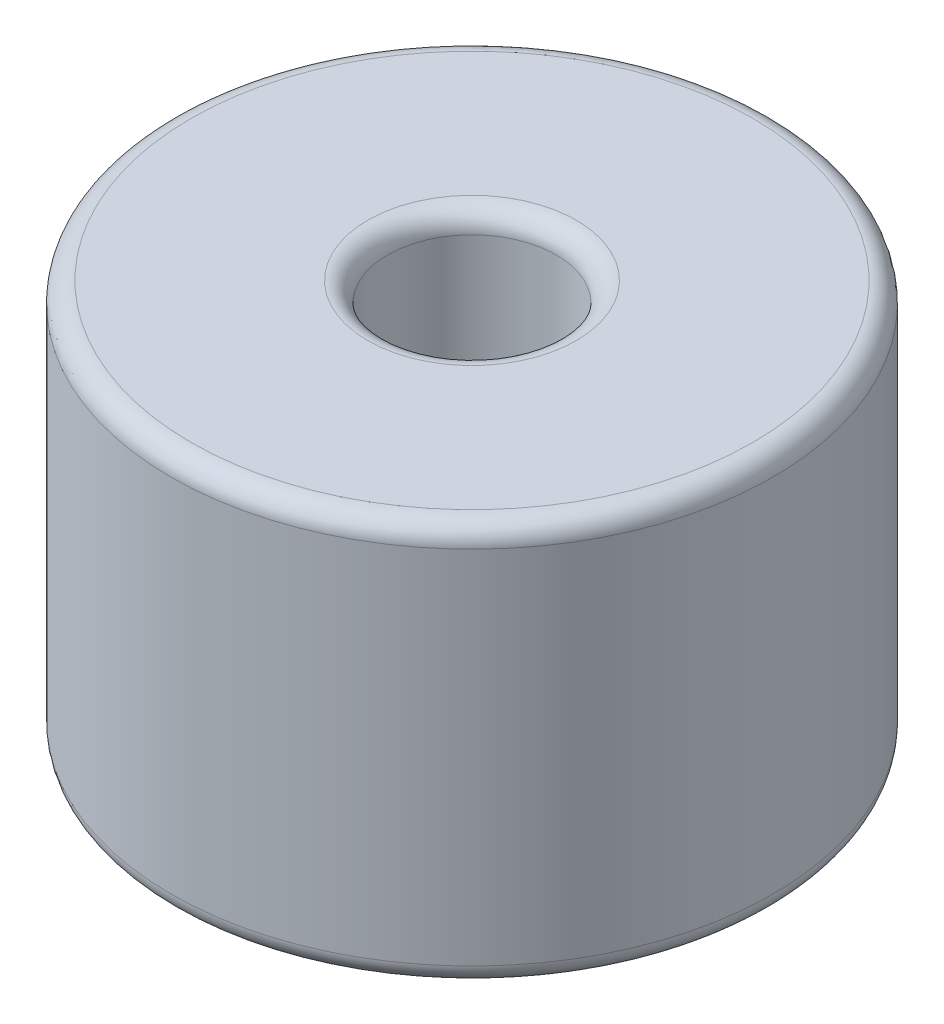
ISO-10303-21;
HEADER;
FILE_DESCRIPTION(('STEP AP214'),'2;1');
FILE_NAME('part.step','',(''),(''),'','','');
FILE_SCHEMA(('AUTOMOTIVE_DESIGN { 1 0 10303 214 1 1 1 1 }'));
ENDSEC;
DATA;
#1=APPLICATION_CONTEXT('core data for automotive mechanical design processes');
#2=APPLICATION_PROTOCOL_DEFINITION('international standard','automotive_design',2000,#1);
#3=PRODUCT_CONTEXT('',#1,'mechanical');
#4=PRODUCT('Part','Part','',(#3));
#5=PRODUCT_RELATED_PRODUCT_CATEGORY('part','',(#4));
#6=PRODUCT_DEFINITION_FORMATION('','',#4);
#7=PRODUCT_DEFINITION_CONTEXT('part definition',#1,'design');
#8=PRODUCT_DEFINITION('design','',#6,#7);
#9=PRODUCT_DEFINITION_SHAPE('','',#8);
#10=(LENGTH_UNIT() NAMED_UNIT(*) SI_UNIT(.MILLI.,.METRE.));
#11=(NAMED_UNIT(*) PLANE_ANGLE_UNIT() SI_UNIT($,.RADIAN.));
#12=(NAMED_UNIT(*) SI_UNIT($,.STERADIAN.) SOLID_ANGLE_UNIT());
#13=UNCERTAINTY_MEASURE_WITH_UNIT(LENGTH_MEASURE(1.E-05),#10,'distance_accuracy_value','');
#14=(GEOMETRIC_REPRESENTATION_CONTEXT(3) GLOBAL_UNCERTAINTY_ASSIGNED_CONTEXT((#13)) GLOBAL_UNIT_ASSIGNED_CONTEXT((#10,
#11,#12)) REPRESENTATION_CONTEXT('',''));
#15=CARTESIAN_POINT('',(0.,0.,0.));
#16=DIRECTION('',(0.,0.,1.));
#17=DIRECTION('',(1.,0.,0.));
#18=AXIS2_PLACEMENT_3D('',#15,#16,#17);
#19=CARTESIAN_POINT('',(0.,10.,0.));
#20=DIRECTION('',(0.,1.,0.));
#21=DIRECTION('',(0.,0.,1.));
#22=AXIS2_PLACEMENT_3D('',#19,#20,#21);
#23=PLANE('',#22);
#24=CARTESIAN_POINT('',(0.,10.,0.));
#25=DIRECTION('',(0.,1.,0.));
#26=DIRECTION('',(0.,0.,1.));
#27=AXIS2_PLACEMENT_3D('',#24,#25,#26);
#28=CIRCLE('',#27,2.6);
#29=CARTESIAN_POINT('',(0.,10.,2.6));
#30=VERTEX_POINT('',#29);
#31=EDGE_CURVE('E42',#30,#30,#28,.F.);
#32=ORIENTED_EDGE('',*,*,#31,.T.);
#33=EDGE_LOOP('',(#32));
#34=FACE_BOUND('',#33,.T.);
#35=CARTESIAN_POINT('',(0.,10.,0.));
#36=DIRECTION('',(0.,1.,0.));
#37=DIRECTION('',(0.,0.,1.));
#38=AXIS2_PLACEMENT_3D('',#35,#36,#37);
#39=CIRCLE('',#38,7.);
#40=CARTESIAN_POINT('',(0.,10.,7.));
#41=VERTEX_POINT('',#40);
#42=EDGE_CURVE('E46',#41,#41,#39,.T.);
#43=ORIENTED_EDGE('',*,*,#42,.T.);
#44=EDGE_LOOP('',(#43));
#45=FACE_BOUND('',#44,.T.);
#46=ADVANCED_FACE('F31',(#34,#45),#23,.T.);
#47=CARTESIAN_POINT('',(0.,0.,0.));
#48=DIRECTION('',(0.,1.,0.));
#49=DIRECTION('',(0.,0.,1.));
#50=AXIS2_PLACEMENT_3D('',#47,#48,#49);
#51=PLANE('',#50);
#52=CARTESIAN_POINT('',(0.,0.,0.));
#53=DIRECTION('',(0.,1.,0.));
#54=DIRECTION('',(0.,0.,1.));
#55=AXIS2_PLACEMENT_3D('',#52,#53,#54);
#56=CIRCLE('',#55,2.6);
#57=CARTESIAN_POINT('',(0.,0.,2.6));
#58=VERTEX_POINT('',#57);
#59=EDGE_CURVE('E57',#58,#58,#56,.T.);
#60=ORIENTED_EDGE('',*,*,#59,.T.);
#61=EDGE_LOOP('',(#60));
#62=FACE_BOUND('',#61,.T.);
#63=CARTESIAN_POINT('',(0.,0.,0.));
#64=DIRECTION('',(0.,1.,0.));
#65=DIRECTION('',(0.,0.,1.));
#66=AXIS2_PLACEMENT_3D('',#63,#64,#65);
#67=CIRCLE('',#66,7.);
#68=CARTESIAN_POINT('',(0.,0.,7.));
#69=VERTEX_POINT('',#68);
#70=EDGE_CURVE('E60',#69,#69,#67,.F.);
#71=ORIENTED_EDGE('',*,*,#70,.T.);
#72=EDGE_LOOP('',(#71));
#73=FACE_BOUND('',#72,.T.);
#74=ADVANCED_FACE('F64',(#62,#73),#51,.F.);
#75=CARTESIAN_POINT('',(0.,10.,0.));
#76=DIRECTION('',(0.,-1.,0.));
#77=DIRECTION('',(0.,0.,-1.));
#78=AXIS2_PLACEMENT_3D('',#75,#76,#77);
#79=CYLINDRICAL_SURFACE('',#78,7.5);
#80=CARTESIAN_POINT('',(0.,0.5,0.));
#81=DIRECTION('',(0.,1.,0.));
#82=DIRECTION('',(0.,0.,1.));
#83=AXIS2_PLACEMENT_3D('',#80,#81,#82);
#84=CIRCLE('',#83,7.5);
#85=CARTESIAN_POINT('',(0.,0.5,7.5));
#86=VERTEX_POINT('',#85);
#87=EDGE_CURVE('E10',#86,#86,#84,.T.);
#88=ORIENTED_EDGE('',*,*,#87,.T.);
#89=EDGE_LOOP('',(#88));
#90=FACE_BOUND('',#89,.T.);
#91=CARTESIAN_POINT('',(0.,9.5,0.));
#92=DIRECTION('',(0.,1.,0.));
#93=DIRECTION('',(0.,0.,1.));
#94=AXIS2_PLACEMENT_3D('',#91,#92,#93);
#95=CIRCLE('',#94,7.5);
#96=CARTESIAN_POINT('',(0.,9.5,7.5));
#97=VERTEX_POINT('',#96);
#98=EDGE_CURVE('E38',#97,#97,#95,.F.);
#99=ORIENTED_EDGE('',*,*,#98,.T.);
#100=EDGE_LOOP('',(#99));
#101=FACE_BOUND('',#100,.T.);
#102=ADVANCED_FACE('F84',(#90,#101),#79,.T.);
#103=CARTESIAN_POINT('',(0.,10.,0.));
#104=DIRECTION('',(0.,-1.,0.));
#105=DIRECTION('',(0.,0.,-1.));
#106=AXIS2_PLACEMENT_3D('',#103,#104,#105);
#107=CYLINDRICAL_SURFACE('',#106,2.1);
#108=CARTESIAN_POINT('',(0.,0.5,0.));
#109=DIRECTION('',(0.,1.,0.));
#110=DIRECTION('',(0.,0.,1.));
#111=AXIS2_PLACEMENT_3D('',#108,#109,#110);
#112=CIRCLE('',#111,2.1);
#113=CARTESIAN_POINT('',(0.,0.5,2.1));
#114=VERTEX_POINT('',#113);
#115=EDGE_CURVE('E51',#114,#114,#112,.F.);
#116=ORIENTED_EDGE('',*,*,#115,.T.);
#117=EDGE_LOOP('',(#116));
#118=FACE_BOUND('',#117,.T.);
#119=CARTESIAN_POINT('',(0.,9.5,0.));
#120=DIRECTION('',(0.,1.,0.));
#121=DIRECTION('',(0.,0.,1.));
#122=AXIS2_PLACEMENT_3D('',#119,#120,#121);
#123=CIRCLE('',#122,2.1);
#124=CARTESIAN_POINT('',(0.,9.5,2.1));
#125=VERTEX_POINT('',#124);
#126=EDGE_CURVE('E54',#125,#125,#123,.T.);
#127=ORIENTED_EDGE('',*,*,#126,.T.);
#128=EDGE_LOOP('',(#127));
#129=FACE_BOUND('',#128,.T.);
#130=ADVANCED_FACE('F89',(#118,#129),#107,.F.);
#131=CARTESIAN_POINT('',(0.,0.5,0.));
#132=DIRECTION('',(0.,1.,0.));
#133=DIRECTION('',(0.,0.,1.));
#134=AXIS2_PLACEMENT_3D('',#131,#132,#133);
#135=TOROIDAL_SURFACE('',#134,2.6,0.5);
#136=ORIENTED_EDGE('',*,*,#115,.F.);
#137=EDGE_LOOP('',(#136));
#138=FACE_BOUND('',#137,.T.);
#139=ORIENTED_EDGE('',*,*,#59,.F.);
#140=EDGE_LOOP('',(#139));
#141=FACE_BOUND('',#140,.T.);
#142=ADVANCED_FACE('F75',(#138,#141),#135,.T.);
#143=CARTESIAN_POINT('',(0.,9.5,0.));
#144=DIRECTION('',(0.,1.,0.));
#145=DIRECTION('',(0.,0.,1.));
#146=AXIS2_PLACEMENT_3D('',#143,#144,#145);
#147=TOROIDAL_SURFACE('',#146,2.6,0.5);
#148=ORIENTED_EDGE('',*,*,#31,.F.);
#149=EDGE_LOOP('',(#148));
#150=FACE_BOUND('',#149,.T.);
#151=ORIENTED_EDGE('',*,*,#126,.F.);
#152=EDGE_LOOP('',(#151));
#153=FACE_BOUND('',#152,.T.);
#154=ADVANCED_FACE('F69',(#150,#153),#147,.T.);
#155=CARTESIAN_POINT('',(0.,0.5,0.));
#156=DIRECTION('',(0.,1.,0.));
#157=DIRECTION('',(0.,0.,1.));
#158=AXIS2_PLACEMENT_3D('',#155,#156,#157);
#159=TOROIDAL_SURFACE('',#158,7.,0.5);
#160=ORIENTED_EDGE('',*,*,#70,.F.);
#161=EDGE_LOOP('',(#160));
#162=FACE_BOUND('',#161,.T.);
#163=ORIENTED_EDGE('',*,*,#87,.F.);
#164=EDGE_LOOP('',(#163));
#165=FACE_BOUND('',#164,.T.);
#166=ADVANCED_FACE('F66',(#162,#165),#159,.T.);
#167=CARTESIAN_POINT('',(0.,9.5,0.));
#168=DIRECTION('',(0.,1.,0.));
#169=DIRECTION('',(0.,0.,1.));
#170=AXIS2_PLACEMENT_3D('',#167,#168,#169);
#171=TOROIDAL_SURFACE('',#170,7.,0.5);
#172=ORIENTED_EDGE('',*,*,#98,.F.);
#173=EDGE_LOOP('',(#172));
#174=FACE_BOUND('',#173,.T.);
#175=ORIENTED_EDGE('',*,*,#42,.F.);
#176=EDGE_LOOP('',(#175));
#177=FACE_BOUND('',#176,.T.);
#178=ADVANCED_FACE('F33',(#174,#177),#171,.T.);
#179=CLOSED_SHELL('',(#46,#74,#102,#130,#142,#154,#166,#178));
#180=MANIFOLD_SOLID_BREP('B2',#179);
#181=ADVANCED_BREP_SHAPE_REPRESENTATION('',(#18,#180),#14);
#182=SHAPE_DEFINITION_REPRESENTATION(#9,#181);
ENDSEC;
END-ISO-10303-21;
